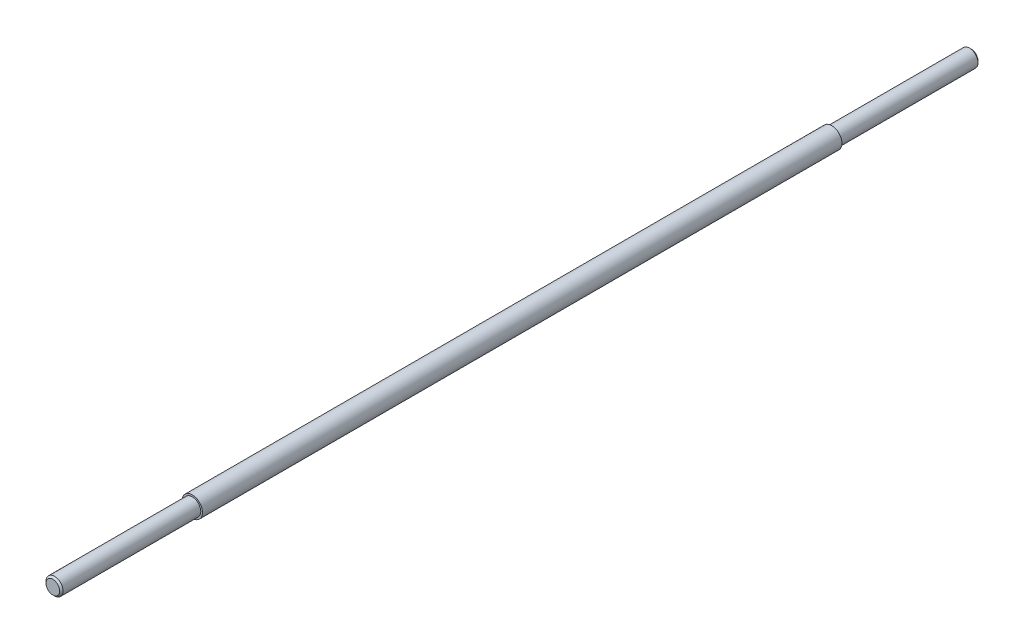
ISO-10303-21;
HEADER;
FILE_DESCRIPTION(('STEP AP214'),'2;1');
FILE_NAME('part.step','',(''),(''),'','','');
FILE_SCHEMA(('AUTOMOTIVE_DESIGN { 1 0 10303 214 1 1 1 1 }'));
ENDSEC;
DATA;
#1=APPLICATION_CONTEXT('core data for automotive mechanical design processes');
#2=APPLICATION_PROTOCOL_DEFINITION('international standard','automotive_design',2000,#1);
#3=PRODUCT_CONTEXT('',#1,'mechanical');
#4=PRODUCT('Part','Part','',(#3));
#5=PRODUCT_RELATED_PRODUCT_CATEGORY('part','',(#4));
#6=PRODUCT_DEFINITION_FORMATION('','',#4);
#7=PRODUCT_DEFINITION_CONTEXT('part definition',#1,'design');
#8=PRODUCT_DEFINITION('design','',#6,#7);
#9=PRODUCT_DEFINITION_SHAPE('','',#8);
#10=(LENGTH_UNIT() NAMED_UNIT(*) SI_UNIT(.MILLI.,.METRE.));
#11=(NAMED_UNIT(*) PLANE_ANGLE_UNIT() SI_UNIT($,.RADIAN.));
#12=(NAMED_UNIT(*) SI_UNIT($,.STERADIAN.) SOLID_ANGLE_UNIT());
#13=UNCERTAINTY_MEASURE_WITH_UNIT(LENGTH_MEASURE(1.E-05),#10,'distance_accuracy_value','');
#14=(GEOMETRIC_REPRESENTATION_CONTEXT(3) GLOBAL_UNCERTAINTY_ASSIGNED_CONTEXT((#13)) GLOBAL_UNIT_ASSIGNED_CONTEXT((#10,
#11,#12)) REPRESENTATION_CONTEXT('',''));
#15=CARTESIAN_POINT('',(0.,0.,0.));
#16=DIRECTION('',(0.,0.,1.));
#17=DIRECTION('',(1.,0.,0.));
#18=AXIS2_PLACEMENT_3D('',#15,#16,#17);
#19=CARTESIAN_POINT('',(-7.81618684113036,3.16715377577402,188.));
#20=DIRECTION('',(0.,0.,-1.));
#21=DIRECTION('',(-1.,0.,0.));
#22=AXIS2_PLACEMENT_3D('',#19,#20,#21);
#23=CYLINDRICAL_SURFACE('',#22,3.);
#24=CARTESIAN_POINT('',(-7.81618684113036,3.16715377577402,188.));
#25=DIRECTION('',(0.,0.,1.));
#26=DIRECTION('',(1.,0.,0.));
#27=AXIS2_PLACEMENT_3D('',#24,#25,#26);
#28=CIRCLE('',#27,3.);
#29=CARTESIAN_POINT('',(-4.81618684113036,3.16715377577402,188.));
#30=VERTEX_POINT('',#29);
#31=EDGE_CURVE('E55',#30,#30,#28,.T.);
#32=ORIENTED_EDGE('',*,*,#31,.F.);
#33=EDGE_LOOP('',(#32));
#34=FACE_BOUND('',#33,.T.);
#35=CARTESIAN_POINT('',(-7.81618684113036,3.16715377577402,0.));
#36=DIRECTION('',(0.,0.,1.));
#37=DIRECTION('',(1.,0.,0.));
#38=AXIS2_PLACEMENT_3D('',#35,#36,#37);
#39=CIRCLE('',#38,3.);
#40=CARTESIAN_POINT('',(-4.81618684113036,3.16715377577402,0.));
#41=VERTEX_POINT('',#40);
#42=EDGE_CURVE('E56',#41,#41,#39,.T.);
#43=ORIENTED_EDGE('',*,*,#42,.T.);
#44=EDGE_LOOP('',(#43));
#45=FACE_BOUND('',#44,.T.);
#46=ADVANCED_FACE('F32',(#34,#45),#23,.T.);
#47=CARTESIAN_POINT('',(-7.81618684113036,3.16715377577402,188.));
#48=DIRECTION('',(0.,0.,1.));
#49=DIRECTION('',(1.,0.,0.));
#50=AXIS2_PLACEMENT_3D('',#47,#48,#49);
#51=PLANE('',#50);
#52=CARTESIAN_POINT('',(-7.81618684113036,3.16715377577402,188.));
#53=DIRECTION('',(0.,0.,1.));
#54=DIRECTION('',(1.,0.,0.));
#55=AXIS2_PLACEMENT_3D('',#52,#53,#54);
#56=CIRCLE('',#55,2.5);
#57=CARTESIAN_POINT('',(-5.31618684113036,3.16715377577402,188.));
#58=VERTEX_POINT('',#57);
#59=EDGE_CURVE('E59',#58,#58,#56,.T.);
#60=ORIENTED_EDGE('',*,*,#59,.F.);
#61=EDGE_LOOP('',(#60));
#62=FACE_BOUND('',#61,.T.);
#63=ORIENTED_EDGE('',*,*,#31,.T.);
#64=EDGE_LOOP('',(#63));
#65=FACE_BOUND('',#64,.T.);
#66=ADVANCED_FACE('F67',(#62,#65),#51,.T.);
#67=CARTESIAN_POINT('',(-7.81618684113036,3.16715377577402,0.));
#68=DIRECTION('',(0.,0.,1.));
#69=DIRECTION('',(1.,0.,0.));
#70=AXIS2_PLACEMENT_3D('',#67,#68,#69);
#71=PLANE('',#70);
#72=CARTESIAN_POINT('',(-7.81618684113036,3.16715377577402,0.));
#73=DIRECTION('',(0.,0.,1.));
#74=DIRECTION('',(1.,0.,0.));
#75=AXIS2_PLACEMENT_3D('',#72,#73,#74);
#76=CIRCLE('',#75,2.5);
#77=CARTESIAN_POINT('',(-5.31618684113036,3.16715377577402,0.));
#78=VERTEX_POINT('',#77);
#79=EDGE_CURVE('E52',#78,#78,#76,.F.);
#80=ORIENTED_EDGE('',*,*,#79,.F.);
#81=EDGE_LOOP('',(#80));
#82=FACE_BOUND('',#81,.T.);
#83=ORIENTED_EDGE('',*,*,#42,.F.);
#84=EDGE_LOOP('',(#83));
#85=FACE_BOUND('',#84,.T.);
#86=ADVANCED_FACE('F70',(#82,#85),#71,.F.);
#87=CARTESIAN_POINT('',(-7.81618684113036,3.16715377577402,-41.));
#88=DIRECTION('',(0.,0.,1.));
#89=DIRECTION('',(1.,0.,0.));
#90=AXIS2_PLACEMENT_3D('',#87,#88,#89);
#91=CYLINDRICAL_SURFACE('',#90,2.5);
#92=CARTESIAN_POINT('',(-7.81618684113036,3.16715377577402,-40.5));
#93=DIRECTION('',(0.,0.,-1.));
#94=DIRECTION('',(-1.,0.,0.));
#95=AXIS2_PLACEMENT_3D('',#92,#93,#94);
#96=CIRCLE('',#95,2.5);
#97=CARTESIAN_POINT('',(-10.3161868411304,3.16715377577402,-40.5));
#98=VERTEX_POINT('',#97);
#99=EDGE_CURVE('E43',#98,#98,#96,.F.);
#100=ORIENTED_EDGE('',*,*,#99,.T.);
#101=EDGE_LOOP('',(#100));
#102=FACE_BOUND('',#101,.T.);
#103=ORIENTED_EDGE('',*,*,#79,.T.);
#104=EDGE_LOOP('',(#103));
#105=FACE_BOUND('',#104,.T.);
#106=ADVANCED_FACE('F80',(#102,#105),#91,.T.);
#107=CARTESIAN_POINT('',(-7.81618684113036,3.16715377577402,-41.));
#108=DIRECTION('',(0.,0.,-1.));
#109=DIRECTION('',(-1.,0.,0.));
#110=AXIS2_PLACEMENT_3D('',#107,#108,#109);
#111=PLANE('',#110);
#112=CARTESIAN_POINT('',(-7.81618684113036,3.16715377577402,-41.));
#113=DIRECTION('',(0.,0.,-1.));
#114=DIRECTION('',(-1.,0.,0.));
#115=AXIS2_PLACEMENT_3D('',#112,#113,#114);
#116=CIRCLE('',#115,2.);
#117=CARTESIAN_POINT('',(-9.81618684113036,3.16715377577402,-41.));
#118=VERTEX_POINT('',#117);
#119=EDGE_CURVE('E47',#118,#118,#116,.T.);
#120=ORIENTED_EDGE('',*,*,#119,.T.);
#121=EDGE_LOOP('',(#120));
#122=FACE_BOUND('',#121,.T.);
#123=ADVANCED_FACE('F86',(#122),#111,.T.);
#124=CARTESIAN_POINT('',(-7.81618684113036,3.16715377577402,229.));
#125=DIRECTION('',(0.,0.,-1.));
#126=DIRECTION('',(-1.,0.,0.));
#127=AXIS2_PLACEMENT_3D('',#124,#125,#126);
#128=CYLINDRICAL_SURFACE('',#127,2.5);
#129=CARTESIAN_POINT('',(-7.81618684113036,3.16715377577402,228.5));
#130=DIRECTION('',(0.,0.,1.));
#131=DIRECTION('',(1.,0.,0.));
#132=AXIS2_PLACEMENT_3D('',#129,#130,#131);
#133=CIRCLE('',#132,2.5);
#134=CARTESIAN_POINT('',(-5.31618684113036,3.16715377577402,228.5));
#135=VERTEX_POINT('',#134);
#136=EDGE_CURVE('E10',#135,#135,#133,.F.);
#137=ORIENTED_EDGE('',*,*,#136,.T.);
#138=EDGE_LOOP('',(#137));
#139=FACE_BOUND('',#138,.T.);
#140=ORIENTED_EDGE('',*,*,#59,.T.);
#141=EDGE_LOOP('',(#140));
#142=FACE_BOUND('',#141,.T.);
#143=ADVANCED_FACE('F65',(#139,#142),#128,.T.);
#144=CARTESIAN_POINT('',(-7.81618684113036,3.16715377577402,229.));
#145=DIRECTION('',(0.,0.,1.));
#146=DIRECTION('',(1.,0.,0.));
#147=AXIS2_PLACEMENT_3D('',#144,#145,#146);
#148=PLANE('',#147);
#149=CARTESIAN_POINT('',(-7.81618684113036,3.16715377577402,229.));
#150=DIRECTION('',(0.,0.,1.));
#151=DIRECTION('',(1.,0.,0.));
#152=AXIS2_PLACEMENT_3D('',#149,#150,#151);
#153=CIRCLE('',#152,2.00000000000003);
#154=CARTESIAN_POINT('',(-5.81618684113033,3.16715377577402,229.));
#155=VERTEX_POINT('',#154);
#156=EDGE_CURVE('E39',#155,#155,#153,.T.);
#157=ORIENTED_EDGE('',*,*,#156,.T.);
#158=EDGE_LOOP('',(#157));
#159=FACE_BOUND('',#158,.T.);
#160=ADVANCED_FACE('F92',(#159),#148,.T.);
#161=CARTESIAN_POINT('',(-7.81618684113036,3.16715377577402,-41.));
#162=DIRECTION('',(0.,0.,1.));
#163=DIRECTION('',(1.,0.,0.));
#164=AXIS2_PLACEMENT_3D('',#161,#162,#163);
#165=CONICAL_SURFACE('',#164,2.,0.78539816339744);
#166=ORIENTED_EDGE('',*,*,#99,.F.);
#167=EDGE_LOOP('',(#166));
#168=FACE_BOUND('',#167,.T.);
#169=ORIENTED_EDGE('',*,*,#119,.F.);
#170=EDGE_LOOP('',(#169));
#171=FACE_BOUND('',#170,.T.);
#172=ADVANCED_FACE('F90',(#168,#171),#165,.T.);
#173=CARTESIAN_POINT('',(-7.81618684113036,3.16715377577402,229.));
#174=DIRECTION('',(0.,0.,-1.));
#175=DIRECTION('',(-1.,0.,0.));
#176=AXIS2_PLACEMENT_3D('',#173,#174,#175);
#177=CONICAL_SURFACE('',#176,2.00000000000003,0.785398163397474);
#178=ORIENTED_EDGE('',*,*,#136,.F.);
#179=EDGE_LOOP('',(#178));
#180=FACE_BOUND('',#179,.T.);
#181=ORIENTED_EDGE('',*,*,#156,.F.);
#182=EDGE_LOOP('',(#181));
#183=FACE_BOUND('',#182,.T.);
#184=ADVANCED_FACE('F34',(#180,#183),#177,.T.);
#185=CLOSED_SHELL('',(#46,#66,#86,#106,#123,#143,#160,#172,#184));
#186=MANIFOLD_SOLID_BREP('B2',#185);
#187=ADVANCED_BREP_SHAPE_REPRESENTATION('',(#18,#186),#14);
#188=SHAPE_DEFINITION_REPRESENTATION(#9,#187);
ENDSEC;
END-ISO-10303-21;
